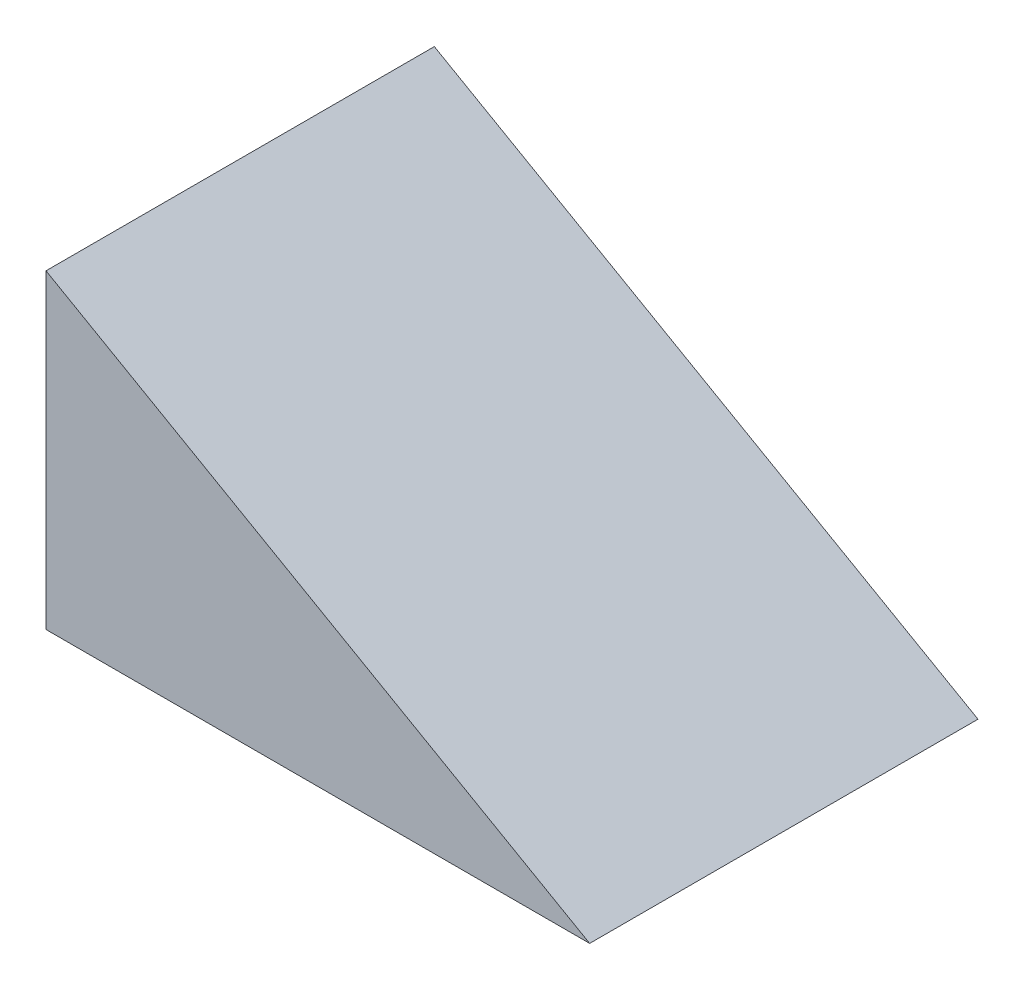
ISO-10303-21;
HEADER;
FILE_DESCRIPTION(('STEP AP214'),'2;1');
FILE_NAME('part.step','',(''),(''),'','','');
FILE_SCHEMA(('AUTOMOTIVE_DESIGN { 1 0 10303 214 1 1 1 1 }'));
ENDSEC;
DATA;
#1=APPLICATION_CONTEXT('core data for automotive mechanical design processes');
#2=APPLICATION_PROTOCOL_DEFINITION('international standard','automotive_design',2000,#1);
#3=PRODUCT_CONTEXT('',#1,'mechanical');
#4=PRODUCT('Part','Part','',(#3));
#5=PRODUCT_RELATED_PRODUCT_CATEGORY('part','',(#4));
#6=PRODUCT_DEFINITION_FORMATION('','',#4);
#7=PRODUCT_DEFINITION_CONTEXT('part definition',#1,'design');
#8=PRODUCT_DEFINITION('design','',#6,#7);
#9=PRODUCT_DEFINITION_SHAPE('','',#8);
#10=(LENGTH_UNIT() NAMED_UNIT(*) SI_UNIT(.MILLI.,.METRE.));
#11=(NAMED_UNIT(*) PLANE_ANGLE_UNIT() SI_UNIT($,.RADIAN.));
#12=(NAMED_UNIT(*) SI_UNIT($,.STERADIAN.) SOLID_ANGLE_UNIT());
#13=UNCERTAINTY_MEASURE_WITH_UNIT(LENGTH_MEASURE(1.E-05),#10,'distance_accuracy_value','');
#14=(GEOMETRIC_REPRESENTATION_CONTEXT(3) GLOBAL_UNCERTAINTY_ASSIGNED_CONTEXT((#13)) GLOBAL_UNIT_ASSIGNED_CONTEXT((#10,
#11,#12)) REPRESENTATION_CONTEXT('',''));
#15=CARTESIAN_POINT('',(0.,0.,0.));
#16=DIRECTION('',(0.,0.,1.));
#17=DIRECTION('',(1.,0.,0.));
#18=AXIS2_PLACEMENT_3D('',#15,#16,#17);
#19=CARTESIAN_POINT('',(0.,40.,50.));
#20=DIRECTION('',(1.,0.,0.));
#21=DIRECTION('',(0.,0.,-1.));
#22=AXIS2_PLACEMENT_3D('',#19,#20,#21);
#23=PLANE('',#22);
#24=DIRECTION('',(0.,-1.,0.));
#25=VECTOR('',#24,1.);
#26=CARTESIAN_POINT('',(0.,40.,0.));
#27=LINE('',#26,#25);
#28=CARTESIAN_POINT('',(0.,40.,0.));
#29=VERTEX_POINT('',#28);
#30=CARTESIAN_POINT('',(0.,0.,0.));
#31=VERTEX_POINT('',#30);
#32=EDGE_CURVE('E95',#29,#31,#27,.T.);
#33=ORIENTED_EDGE('',*,*,#32,.T.);
#34=DIRECTION('',(0.,0.,-1.));
#35=VECTOR('',#34,1.);
#36=CARTESIAN_POINT('',(0.,0.,50.));
#37=LINE('',#36,#35);
#38=CARTESIAN_POINT('',(0.,0.,50.));
#39=VERTEX_POINT('',#38);
#40=EDGE_CURVE('E11',#39,#31,#37,.T.);
#41=ORIENTED_EDGE('',*,*,#40,.F.);
#42=DIRECTION('',(0.,-1.,0.));
#43=VECTOR('',#42,1.);
#44=CARTESIAN_POINT('',(0.,40.,50.));
#45=LINE('',#44,#43);
#46=CARTESIAN_POINT('',(0.,40.,50.));
#47=VERTEX_POINT('',#46);
#48=EDGE_CURVE('E87',#47,#39,#45,.T.);
#49=ORIENTED_EDGE('',*,*,#48,.F.);
#50=DIRECTION('',(0.,0.,-1.));
#51=VECTOR('',#50,1.);
#52=CARTESIAN_POINT('',(0.,40.,50.));
#53=LINE('',#52,#51);
#54=EDGE_CURVE('E96',#47,#29,#53,.T.);
#55=ORIENTED_EDGE('',*,*,#54,.T.);
#56=EDGE_LOOP('',(#33,#41,#49,#55));
#57=FACE_BOUND('',#56,.T.);
#58=ADVANCED_FACE('F45',(#57),#23,.F.);
#59=CARTESIAN_POINT('',(0.,0.,50.));
#60=DIRECTION('',(0.,1.,0.));
#61=DIRECTION('',(0.,0.,1.));
#62=AXIS2_PLACEMENT_3D('',#59,#60,#61);
#63=PLANE('',#62);
#64=DIRECTION('',(1.,0.,0.));
#65=VECTOR('',#64,1.);
#66=CARTESIAN_POINT('',(0.,0.,0.));
#67=LINE('',#66,#65);
#68=CARTESIAN_POINT('',(70.,0.,0.));
#69=VERTEX_POINT('',#68);
#70=EDGE_CURVE('E74',#31,#69,#67,.T.);
#71=ORIENTED_EDGE('',*,*,#70,.T.);
#72=DIRECTION('',(0.,0.,-1.));
#73=VECTOR('',#72,1.);
#74=CARTESIAN_POINT('',(70.,0.,50.));
#75=LINE('',#74,#73);
#76=CARTESIAN_POINT('',(70.,0.,50.));
#77=VERTEX_POINT('',#76);
#78=EDGE_CURVE('E54',#77,#69,#75,.T.);
#79=ORIENTED_EDGE('',*,*,#78,.F.);
#80=DIRECTION('',(1.,0.,0.));
#81=VECTOR('',#80,1.);
#82=CARTESIAN_POINT('',(0.,0.,50.));
#83=LINE('',#82,#81);
#84=EDGE_CURVE('E82',#39,#77,#83,.T.);
#85=ORIENTED_EDGE('',*,*,#84,.F.);
#86=ORIENTED_EDGE('',*,*,#40,.T.);
#87=EDGE_LOOP('',(#71,#79,#85,#86));
#88=FACE_BOUND('',#87,.T.);
#89=ADVANCED_FACE('F83',(#88),#63,.F.);
#90=CARTESIAN_POINT('',(70.,0.,50.));
#91=DIRECTION('',(-0.496138938356834,-0.868243142124459,0.));
#92=DIRECTION('',(0.868243142124459,-0.496138938356834,0.));
#93=AXIS2_PLACEMENT_3D('',#90,#91,#92);
#94=PLANE('',#93);
#95=DIRECTION('',(-0.868243142124459,0.496138938356834,0.));
#96=VECTOR('',#95,1.);
#97=CARTESIAN_POINT('',(70.,0.,0.));
#98=LINE('',#97,#96);
#99=EDGE_CURVE('E79',#69,#29,#98,.T.);
#100=ORIENTED_EDGE('',*,*,#99,.T.);
#101=ORIENTED_EDGE('',*,*,#54,.F.);
#102=DIRECTION('',(-0.868243142124459,0.496138938356834,0.));
#103=VECTOR('',#102,1.);
#104=CARTESIAN_POINT('',(70.,0.,50.));
#105=LINE('',#104,#103);
#106=EDGE_CURVE('E62',#77,#47,#105,.T.);
#107=ORIENTED_EDGE('',*,*,#106,.F.);
#108=ORIENTED_EDGE('',*,*,#78,.T.);
#109=EDGE_LOOP('',(#100,#101,#107,#108));
#110=FACE_BOUND('',#109,.T.);
#111=ADVANCED_FACE('F108',(#110),#94,.F.);
#112=CARTESIAN_POINT('',(0.,0.,50.));
#113=DIRECTION('',(0.,0.,1.));
#114=DIRECTION('',(1.,0.,0.));
#115=AXIS2_PLACEMENT_3D('',#112,#113,#114);
#116=PLANE('',#115);
#117=ORIENTED_EDGE('',*,*,#48,.T.);
#118=ORIENTED_EDGE('',*,*,#84,.T.);
#119=ORIENTED_EDGE('',*,*,#106,.T.);
#120=EDGE_LOOP('',(#117,#118,#119));
#121=FACE_BOUND('',#120,.T.);
#122=ADVANCED_FACE('F90',(#121),#116,.T.);
#123=CARTESIAN_POINT('',(0.,0.,0.));
#124=DIRECTION('',(0.,0.,1.));
#125=DIRECTION('',(1.,0.,0.));
#126=AXIS2_PLACEMENT_3D('',#123,#124,#125);
#127=PLANE('',#126);
#128=ORIENTED_EDGE('',*,*,#32,.F.);
#129=ORIENTED_EDGE('',*,*,#99,.F.);
#130=ORIENTED_EDGE('',*,*,#70,.F.);
#131=EDGE_LOOP('',(#128,#129,#130));
#132=FACE_BOUND('',#131,.T.);
#133=ADVANCED_FACE('F109',(#132),#127,.F.);
#134=CLOSED_SHELL('',(#58,#89,#111,#122,#133));
#135=MANIFOLD_SOLID_BREP('B2',#134);
#136=ADVANCED_BREP_SHAPE_REPRESENTATION('',(#18,#135),#14);
#137=SHAPE_DEFINITION_REPRESENTATION(#9,#136);
ENDSEC;
END-ISO-10303-21;
